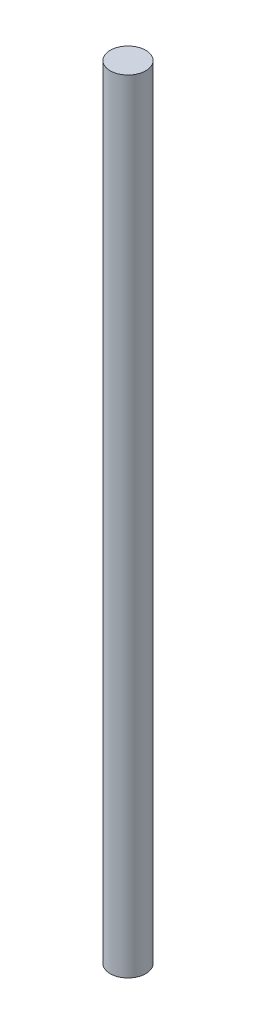
ISO-10303-21;
HEADER;
FILE_DESCRIPTION(('STEP AP214'),'2;1');
FILE_NAME('part.step','',(''),(''),'','','');
FILE_SCHEMA(('AUTOMOTIVE_DESIGN { 1 0 10303 214 1 1 1 1 }'));
ENDSEC;
DATA;
#1=APPLICATION_CONTEXT('core data for automotive mechanical design processes');
#2=APPLICATION_PROTOCOL_DEFINITION('international standard','automotive_design',2000,#1);
#3=PRODUCT_CONTEXT('',#1,'mechanical');
#4=PRODUCT('Part','Part','',(#3));
#5=PRODUCT_RELATED_PRODUCT_CATEGORY('part','',(#4));
#6=PRODUCT_DEFINITION_FORMATION('','',#4);
#7=PRODUCT_DEFINITION_CONTEXT('part definition',#1,'design');
#8=PRODUCT_DEFINITION('design','',#6,#7);
#9=PRODUCT_DEFINITION_SHAPE('','',#8);
#10=(LENGTH_UNIT() NAMED_UNIT(*) SI_UNIT(.MILLI.,.METRE.));
#11=(NAMED_UNIT(*) PLANE_ANGLE_UNIT() SI_UNIT($,.RADIAN.));
#12=(NAMED_UNIT(*) SI_UNIT($,.STERADIAN.) SOLID_ANGLE_UNIT());
#13=UNCERTAINTY_MEASURE_WITH_UNIT(LENGTH_MEASURE(1.E-05),#10,'distance_accuracy_value','');
#14=(GEOMETRIC_REPRESENTATION_CONTEXT(3) GLOBAL_UNCERTAINTY_ASSIGNED_CONTEXT((#13)) GLOBAL_UNIT_ASSIGNED_CONTEXT((#10,
#11,#12)) REPRESENTATION_CONTEXT('',''));
#15=CARTESIAN_POINT('',(0.,0.,0.));
#16=DIRECTION('',(0.,0.,1.));
#17=DIRECTION('',(1.,0.,0.));
#18=AXIS2_PLACEMENT_3D('',#15,#16,#17);
#19=CARTESIAN_POINT('',(0.,22.,0.));
#20=DIRECTION('',(0.,-1.,0.));
#21=DIRECTION('',(0.,0.,-1.));
#22=AXIS2_PLACEMENT_3D('',#19,#20,#21);
#23=CYLINDRICAL_SURFACE('',#22,0.5);
#24=CARTESIAN_POINT('',(0.,22.,0.));
#25=DIRECTION('',(0.,1.,0.));
#26=DIRECTION('',(0.,0.,1.));
#27=AXIS2_PLACEMENT_3D('',#24,#25,#26);
#28=CIRCLE('',#27,0.5);
#29=CARTESIAN_POINT('',(0.,22.,0.5));
#30=VERTEX_POINT('',#29);
#31=EDGE_CURVE('E10',#30,#30,#28,.T.);
#32=ORIENTED_EDGE('',*,*,#31,.F.);
#33=EDGE_LOOP('',(#32));
#34=FACE_BOUND('',#33,.T.);
#35=CARTESIAN_POINT('',(0.,0.,0.));
#36=DIRECTION('',(0.,1.,0.));
#37=DIRECTION('',(0.,0.,1.));
#38=AXIS2_PLACEMENT_3D('',#35,#36,#37);
#39=CIRCLE('',#38,0.5);
#40=CARTESIAN_POINT('',(0.,0.,0.5));
#41=VERTEX_POINT('',#40);
#42=EDGE_CURVE('E35',#41,#41,#39,.T.);
#43=ORIENTED_EDGE('',*,*,#42,.T.);
#44=EDGE_LOOP('',(#43));
#45=FACE_BOUND('',#44,.T.);
#46=ADVANCED_FACE('F32',(#34,#45),#23,.T.);
#47=CARTESIAN_POINT('',(0.,22.,0.));
#48=DIRECTION('',(0.,1.,0.));
#49=DIRECTION('',(0.,0.,1.));
#50=AXIS2_PLACEMENT_3D('',#47,#48,#49);
#51=PLANE('',#50);
#52=ORIENTED_EDGE('',*,*,#31,.T.);
#53=EDGE_LOOP('',(#52));
#54=FACE_BOUND('',#53,.T.);
#55=ADVANCED_FACE('F47',(#54),#51,.T.);
#56=CARTESIAN_POINT('',(0.,0.,0.));
#57=DIRECTION('',(0.,1.,0.));
#58=DIRECTION('',(0.,0.,1.));
#59=AXIS2_PLACEMENT_3D('',#56,#57,#58);
#60=PLANE('',#59);
#61=ORIENTED_EDGE('',*,*,#42,.F.);
#62=EDGE_LOOP('',(#61));
#63=FACE_BOUND('',#62,.T.);
#64=ADVANCED_FACE('F45',(#63),#60,.F.);
#65=CLOSED_SHELL('',(#46,#55,#64));
#66=MANIFOLD_SOLID_BREP('B2',#65);
#67=ADVANCED_BREP_SHAPE_REPRESENTATION('',(#18,#66),#14);
#68=SHAPE_DEFINITION_REPRESENTATION(#9,#67);
ENDSEC;
END-ISO-10303-21;
